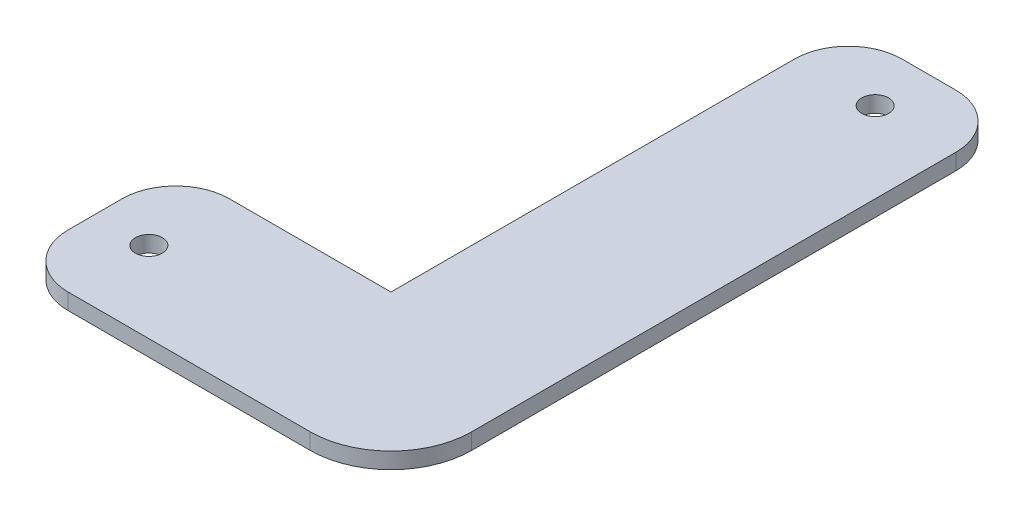
ISO-10303-21;
HEADER;
FILE_DESCRIPTION(('STEP AP214'),'2;1');
FILE_NAME('part.step','',(''),(''),'','','');
FILE_SCHEMA(('AUTOMOTIVE_DESIGN { 1 0 10303 214 1 1 1 1 }'));
ENDSEC;
DATA;
#1=APPLICATION_CONTEXT('core data for automotive mechanical design processes');
#2=APPLICATION_PROTOCOL_DEFINITION('international standard','automotive_design',2000,#1);
#3=PRODUCT_CONTEXT('',#1,'mechanical');
#4=PRODUCT('Part','Part','',(#3));
#5=PRODUCT_RELATED_PRODUCT_CATEGORY('part','',(#4));
#6=PRODUCT_DEFINITION_FORMATION('','',#4);
#7=PRODUCT_DEFINITION_CONTEXT('part definition',#1,'design');
#8=PRODUCT_DEFINITION('design','',#6,#7);
#9=PRODUCT_DEFINITION_SHAPE('','',#8);
#10=(LENGTH_UNIT() NAMED_UNIT(*) SI_UNIT(.MILLI.,.METRE.));
#11=(NAMED_UNIT(*) PLANE_ANGLE_UNIT() SI_UNIT($,.RADIAN.));
#12=(NAMED_UNIT(*) SI_UNIT($,.STERADIAN.) SOLID_ANGLE_UNIT());
#13=UNCERTAINTY_MEASURE_WITH_UNIT(LENGTH_MEASURE(1.E-05),#10,'distance_accuracy_value','');
#14=(GEOMETRIC_REPRESENTATION_CONTEXT(3) GLOBAL_UNCERTAINTY_ASSIGNED_CONTEXT((#13)) GLOBAL_UNIT_ASSIGNED_CONTEXT((#10,
#11,#12)) REPRESENTATION_CONTEXT('',''));
#15=CARTESIAN_POINT('',(0.,0.,0.));
#16=DIRECTION('',(0.,0.,1.));
#17=DIRECTION('',(1.,0.,0.));
#18=AXIS2_PLACEMENT_3D('',#15,#16,#17);
#19=CARTESIAN_POINT('',(0.,3.,-115.));
#20=DIRECTION('',(1.,0.,0.));
#21=DIRECTION('',(0.,0.,-1.));
#22=AXIS2_PLACEMENT_3D('',#19,#20,#21);
#23=PLANE('',#22);
#24=DIRECTION('',(0.,0.,1.));
#25=VECTOR('',#24,1.);
#26=CARTESIAN_POINT('',(0.,3.,-115.));
#27=LINE('',#26,#25);
#28=CARTESIAN_POINT('',(0.,3.,-105.));
#29=VERTEX_POINT('',#28);
#30=CARTESIAN_POINT('',(0.,3.,-15.));
#31=VERTEX_POINT('',#30);
#32=EDGE_CURVE('E182',#29,#31,#27,.T.);
#33=ORIENTED_EDGE('',*,*,#32,.T.);
#34=DIRECTION('',(0.,-1.,0.));
#35=VECTOR('',#34,1.);
#36=CARTESIAN_POINT('',(0.,3.,-15.));
#37=LINE('',#36,#35);
#38=CARTESIAN_POINT('',(0.,0.,-15.));
#39=VERTEX_POINT('',#38);
#40=EDGE_CURVE('E233',#31,#39,#37,.T.);
#41=ORIENTED_EDGE('',*,*,#40,.T.);
#42=DIRECTION('',(0.,0.,1.));
#43=VECTOR('',#42,1.);
#44=CARTESIAN_POINT('',(0.,0.,-115.));
#45=LINE('',#44,#43);
#46=CARTESIAN_POINT('',(0.,0.,-105.));
#47=VERTEX_POINT('',#46);
#48=EDGE_CURVE('E163',#47,#39,#45,.T.);
#49=ORIENTED_EDGE('',*,*,#48,.F.);
#50=DIRECTION('',(0.,-1.,0.));
#51=VECTOR('',#50,1.);
#52=CARTESIAN_POINT('',(0.,3.,-105.));
#53=LINE('',#52,#51);
#54=EDGE_CURVE('E227',#47,#29,#53,.F.);
#55=ORIENTED_EDGE('',*,*,#54,.T.);
#56=EDGE_LOOP('',(#33,#41,#49,#55));
#57=FACE_BOUND('',#56,.T.);
#58=ADVANCED_FACE('F45',(#57),#23,.T.);
#59=CARTESIAN_POINT('',(0.,3.,-115.));
#60=DIRECTION('',(0.,0.,1.));
#61=DIRECTION('',(1.,0.,0.));
#62=AXIS2_PLACEMENT_3D('',#59,#60,#61);
#63=PLANE('',#62);
#64=DIRECTION('',(-1.,0.,0.));
#65=VECTOR('',#64,1.);
#66=CARTESIAN_POINT('',(0.,3.,-115.));
#67=LINE('',#66,#65);
#68=CARTESIAN_POINT('',(-10.,3.,-115.));
#69=VERTEX_POINT('',#68);
#70=CARTESIAN_POINT('',(-20.,3.,-115.));
#71=VERTEX_POINT('',#70);
#72=EDGE_CURVE('E141',#69,#71,#67,.T.);
#73=ORIENTED_EDGE('',*,*,#72,.F.);
#74=DIRECTION('',(0.,-1.,0.));
#75=VECTOR('',#74,1.);
#76=CARTESIAN_POINT('',(-10.,0.,-115.));
#77=LINE('',#76,#75);
#78=CARTESIAN_POINT('',(-10.,0.,-115.));
#79=VERTEX_POINT('',#78);
#80=EDGE_CURVE('E223',#69,#79,#77,.T.);
#81=ORIENTED_EDGE('',*,*,#80,.T.);
#82=DIRECTION('',(-1.,0.,0.));
#83=VECTOR('',#82,1.);
#84=CARTESIAN_POINT('',(0.,0.,-115.));
#85=LINE('',#84,#83);
#86=CARTESIAN_POINT('',(-20.,0.,-115.));
#87=VERTEX_POINT('',#86);
#88=EDGE_CURVE('E179',#79,#87,#85,.T.);
#89=ORIENTED_EDGE('',*,*,#88,.T.);
#90=DIRECTION('',(0.,-1.,0.));
#91=VECTOR('',#90,1.);
#92=CARTESIAN_POINT('',(-20.,3.,-115.));
#93=LINE('',#92,#91);
#94=EDGE_CURVE('E220',#87,#71,#93,.F.);
#95=ORIENTED_EDGE('',*,*,#94,.T.);
#96=EDGE_LOOP('',(#73,#81,#89,#95));
#97=FACE_BOUND('',#96,.T.);
#98=ADVANCED_FACE('F255',(#97),#63,.F.);
#99=CARTESIAN_POINT('',(-30.,3.,-30.));
#100=DIRECTION('',(-1.,0.,0.));
#101=DIRECTION('',(0.,0.,1.));
#102=AXIS2_PLACEMENT_3D('',#99,#100,#101);
#103=PLANE('',#102);
#104=DIRECTION('',(0.,0.,-1.));
#105=VECTOR('',#104,1.);
#106=CARTESIAN_POINT('',(-30.,3.,-30.));
#107=LINE('',#106,#105);
#108=CARTESIAN_POINT('',(-30.,3.,-30.));
#109=VERTEX_POINT('',#108);
#110=CARTESIAN_POINT('',(-30.,3.,-105.));
#111=VERTEX_POINT('',#110);
#112=EDGE_CURVE('E132',#109,#111,#107,.T.);
#113=ORIENTED_EDGE('',*,*,#112,.T.);
#114=DIRECTION('',(0.,-1.,0.));
#115=VECTOR('',#114,1.);
#116=CARTESIAN_POINT('',(-30.,0.,-105.));
#117=LINE('',#116,#115);
#118=CARTESIAN_POINT('',(-30.,0.,-105.));
#119=VERTEX_POINT('',#118);
#120=EDGE_CURVE('E230',#111,#119,#117,.T.);
#121=ORIENTED_EDGE('',*,*,#120,.T.);
#122=DIRECTION('',(0.,0.,-1.));
#123=VECTOR('',#122,1.);
#124=CARTESIAN_POINT('',(-30.,0.,-30.));
#125=LINE('',#124,#123);
#126=CARTESIAN_POINT('',(-30.,0.,-30.));
#127=VERTEX_POINT('',#126);
#128=EDGE_CURVE('E135',#127,#119,#125,.T.);
#129=ORIENTED_EDGE('',*,*,#128,.F.);
#130=DIRECTION('',(0.,-1.,0.));
#131=VECTOR('',#130,1.);
#132=CARTESIAN_POINT('',(-30.,3.,-30.));
#133=LINE('',#132,#131);
#134=EDGE_CURVE('E127',#109,#127,#133,.T.);
#135=ORIENTED_EDGE('',*,*,#134,.F.);
#136=EDGE_LOOP('',(#113,#121,#129,#135));
#137=FACE_BOUND('',#136,.T.);
#138=ADVANCED_FACE('F129',(#137),#103,.T.);
#139=CARTESIAN_POINT('',(-30.,3.,-30.));
#140=DIRECTION('',(0.,0.,1.));
#141=DIRECTION('',(1.,0.,0.));
#142=AXIS2_PLACEMENT_3D('',#139,#140,#141);
#143=PLANE('',#142);
#144=DIRECTION('',(-1.,0.,0.));
#145=VECTOR('',#144,1.);
#146=CARTESIAN_POINT('',(-30.,0.,-30.));
#147=LINE('',#146,#145);
#148=CARTESIAN_POINT('',(-60.,0.,-30.));
#149=VERTEX_POINT('',#148);
#150=EDGE_CURVE('E174',#127,#149,#147,.T.);
#151=ORIENTED_EDGE('',*,*,#150,.T.);
#152=DIRECTION('',(0.,-1.,0.));
#153=VECTOR('',#152,1.);
#154=CARTESIAN_POINT('',(-60.,3.,-30.));
#155=LINE('',#154,#153);
#156=CARTESIAN_POINT('',(-60.,3.,-30.));
#157=VERTEX_POINT('',#156);
#158=EDGE_CURVE('E147',#149,#157,#155,.F.);
#159=ORIENTED_EDGE('',*,*,#158,.T.);
#160=DIRECTION('',(-1.,0.,0.));
#161=VECTOR('',#160,1.);
#162=CARTESIAN_POINT('',(-30.,3.,-30.));
#163=LINE('',#162,#161);
#164=EDGE_CURVE('E144',#109,#157,#163,.T.);
#165=ORIENTED_EDGE('',*,*,#164,.F.);
#166=ORIENTED_EDGE('',*,*,#134,.T.);
#167=EDGE_LOOP('',(#151,#159,#165,#166));
#168=FACE_BOUND('',#167,.T.);
#169=ADVANCED_FACE('F145',(#168),#143,.F.);
#170=CARTESIAN_POINT('',(-70.,3.,-30.));
#171=DIRECTION('',(1.,0.,0.));
#172=DIRECTION('',(0.,0.,-1.));
#173=AXIS2_PLACEMENT_3D('',#170,#171,#172);
#174=PLANE('',#173);
#175=DIRECTION('',(0.,0.,1.));
#176=VECTOR('',#175,1.);
#177=CARTESIAN_POINT('',(-70.,0.,-30.));
#178=LINE('',#177,#176);
#179=CARTESIAN_POINT('',(-70.,0.,-20.));
#180=VERTEX_POINT('',#179);
#181=CARTESIAN_POINT('',(-70.,0.,-10.));
#182=VERTEX_POINT('',#181);
#183=EDGE_CURVE('E170',#180,#182,#178,.T.);
#184=ORIENTED_EDGE('',*,*,#183,.T.);
#185=DIRECTION('',(0.,-1.,0.));
#186=VECTOR('',#185,1.);
#187=CARTESIAN_POINT('',(-70.,3.,-10.));
#188=LINE('',#187,#186);
#189=CARTESIAN_POINT('',(-70.,3.,-10.));
#190=VERTEX_POINT('',#189);
#191=EDGE_CURVE('E203',#182,#190,#188,.F.);
#192=ORIENTED_EDGE('',*,*,#191,.T.);
#193=DIRECTION('',(0.,0.,1.));
#194=VECTOR('',#193,1.);
#195=CARTESIAN_POINT('',(-70.,3.,-30.));
#196=LINE('',#195,#194);
#197=CARTESIAN_POINT('',(-70.,3.,-20.));
#198=VERTEX_POINT('',#197);
#199=EDGE_CURVE('E151',#198,#190,#196,.T.);
#200=ORIENTED_EDGE('',*,*,#199,.F.);
#201=DIRECTION('',(0.,-1.,0.));
#202=VECTOR('',#201,1.);
#203=CARTESIAN_POINT('',(-70.,3.,-20.));
#204=LINE('',#203,#202);
#205=EDGE_CURVE('E199',#198,#180,#204,.T.);
#206=ORIENTED_EDGE('',*,*,#205,.T.);
#207=EDGE_LOOP('',(#184,#192,#200,#206));
#208=FACE_BOUND('',#207,.T.);
#209=ADVANCED_FACE('F267',(#208),#174,.F.);
#210=CARTESIAN_POINT('',(0.,3.,0.));
#211=DIRECTION('',(0.,0.,1.));
#212=DIRECTION('',(1.,0.,0.));
#213=AXIS2_PLACEMENT_3D('',#210,#211,#212);
#214=PLANE('',#213);
#215=DIRECTION('',(-1.,0.,0.));
#216=VECTOR('',#215,1.);
#217=CARTESIAN_POINT('',(0.,0.,0.));
#218=LINE('',#217,#216);
#219=CARTESIAN_POINT('',(-15.,0.,0.));
#220=VERTEX_POINT('',#219);
#221=CARTESIAN_POINT('',(-60.,0.,0.));
#222=VERTEX_POINT('',#221);
#223=EDGE_CURVE('E166',#220,#222,#218,.T.);
#224=ORIENTED_EDGE('',*,*,#223,.F.);
#225=DIRECTION('',(0.,-1.,0.));
#226=VECTOR('',#225,1.);
#227=CARTESIAN_POINT('',(-15.,3.,0.));
#228=LINE('',#227,#226);
#229=CARTESIAN_POINT('',(-15.,3.,0.));
#230=VERTEX_POINT('',#229);
#231=EDGE_CURVE('E54',#220,#230,#228,.F.);
#232=ORIENTED_EDGE('',*,*,#231,.T.);
#233=DIRECTION('',(-1.,0.,0.));
#234=VECTOR('',#233,1.);
#235=CARTESIAN_POINT('',(0.,3.,0.));
#236=LINE('',#235,#234);
#237=CARTESIAN_POINT('',(-60.,3.,0.));
#238=VERTEX_POINT('',#237);
#239=EDGE_CURVE('E270',#230,#238,#236,.T.);
#240=ORIENTED_EDGE('',*,*,#239,.T.);
#241=DIRECTION('',(0.,-1.,0.));
#242=VECTOR('',#241,1.);
#243=CARTESIAN_POINT('',(-60.,0.,0.));
#244=LINE('',#243,#242);
#245=EDGE_CURVE('E140',#238,#222,#244,.T.);
#246=ORIENTED_EDGE('',*,*,#245,.T.);
#247=EDGE_LOOP('',(#224,#232,#240,#246));
#248=FACE_BOUND('',#247,.T.);
#249=ADVANCED_FACE('F303',(#248),#214,.T.);
#250=CARTESIAN_POINT('',(0.,3.,0.));
#251=DIRECTION('',(0.,-1.,0.));
#252=DIRECTION('',(0.,0.,-1.));
#253=AXIS2_PLACEMENT_3D('',#250,#251,#252);
#254=PLANE('',#253);
#255=CARTESIAN_POINT('',(-60.,3.,-15.));
#256=DIRECTION('',(0.,1.,0.));
#257=DIRECTION('',(0.,0.,1.));
#258=AXIS2_PLACEMENT_3D('',#255,#256,#257);
#259=CIRCLE('',#258,2.5);
#260=CARTESIAN_POINT('',(-60.,3.,-12.5));
#261=VERTEX_POINT('',#260);
#262=EDGE_CURVE('E284',#261,#261,#259,.T.);
#263=ORIENTED_EDGE('',*,*,#262,.F.);
#264=EDGE_LOOP('',(#263));
#265=FACE_BOUND('',#264,.T.);
#266=CARTESIAN_POINT('',(-15.,3.,-105.));
#267=DIRECTION('',(0.,1.,0.));
#268=DIRECTION('',(0.,0.,1.));
#269=AXIS2_PLACEMENT_3D('',#266,#267,#268);
#270=CIRCLE('',#269,2.5);
#271=CARTESIAN_POINT('',(-15.,3.,-102.5));
#272=VERTEX_POINT('',#271);
#273=EDGE_CURVE('E280',#272,#272,#270,.T.);
#274=ORIENTED_EDGE('',*,*,#273,.F.);
#275=EDGE_LOOP('',(#274));
#276=FACE_BOUND('',#275,.T.);
#277=ORIENTED_EDGE('',*,*,#239,.F.);
#278=CARTESIAN_POINT('',(-15.,3.,-15.));
#279=DIRECTION('',(0.,-1.,0.));
#280=DIRECTION('',(0.,0.,-1.));
#281=AXIS2_PLACEMENT_3D('',#278,#279,#280);
#282=CIRCLE('',#281,15.);
#283=EDGE_CURVE('E11',#230,#31,#282,.F.);
#284=ORIENTED_EDGE('',*,*,#283,.T.);
#285=ORIENTED_EDGE('',*,*,#32,.F.);
#286=CARTESIAN_POINT('',(-10.,3.,-105.));
#287=DIRECTION('',(0.,-1.,0.));
#288=DIRECTION('',(0.,0.,-1.));
#289=AXIS2_PLACEMENT_3D('',#286,#287,#288);
#290=CIRCLE('',#289,10.);
#291=EDGE_CURVE('E208',#29,#69,#290,.F.);
#292=ORIENTED_EDGE('',*,*,#291,.T.);
#293=ORIENTED_EDGE('',*,*,#72,.T.);
#294=CARTESIAN_POINT('',(-20.,3.,-105.));
#295=DIRECTION('',(0.,-1.,0.));
#296=DIRECTION('',(0.,0.,-1.));
#297=AXIS2_PLACEMENT_3D('',#294,#295,#296);
#298=CIRCLE('',#297,10.);
#299=EDGE_CURVE('E156',#71,#111,#298,.F.);
#300=ORIENTED_EDGE('',*,*,#299,.T.);
#301=ORIENTED_EDGE('',*,*,#112,.F.);
#302=ORIENTED_EDGE('',*,*,#164,.T.);
#303=CARTESIAN_POINT('',(-60.,3.,-20.));
#304=DIRECTION('',(0.,-1.,0.));
#305=DIRECTION('',(0.,0.,-1.));
#306=AXIS2_PLACEMENT_3D('',#303,#304,#305);
#307=CIRCLE('',#306,10.);
#308=EDGE_CURVE('E211',#157,#198,#307,.F.);
#309=ORIENTED_EDGE('',*,*,#308,.T.);
#310=ORIENTED_EDGE('',*,*,#199,.T.);
#311=CARTESIAN_POINT('',(-60.,3.,-9.99999999999999));
#312=DIRECTION('',(0.,-1.,0.));
#313=DIRECTION('',(0.,0.,-1.));
#314=AXIS2_PLACEMENT_3D('',#311,#312,#313);
#315=CIRCLE('',#314,10.);
#316=EDGE_CURVE('E214',#190,#238,#315,.F.);
#317=ORIENTED_EDGE('',*,*,#316,.T.);
#318=EDGE_LOOP('',(#277,#284,#285,#292,#293,#300,#301,#302,#309,#310,#317));
#319=FACE_BOUND('',#318,.T.);
#320=ADVANCED_FACE('F153',(#265,#276,#319),#254,.F.);
#321=CARTESIAN_POINT('',(0.,0.,0.));
#322=DIRECTION('',(0.,-1.,0.));
#323=DIRECTION('',(0.,0.,-1.));
#324=AXIS2_PLACEMENT_3D('',#321,#322,#323);
#325=PLANE('',#324);
#326=CARTESIAN_POINT('',(-60.,0.,-15.));
#327=DIRECTION('',(0.,1.,0.));
#328=DIRECTION('',(0.,0.,1.));
#329=AXIS2_PLACEMENT_3D('',#326,#327,#328);
#330=CIRCLE('',#329,2.5);
#331=CARTESIAN_POINT('',(-60.,0.,-12.5));
#332=VERTEX_POINT('',#331);
#333=EDGE_CURVE('E167',#332,#332,#330,.T.);
#334=ORIENTED_EDGE('',*,*,#333,.T.);
#335=EDGE_LOOP('',(#334));
#336=FACE_BOUND('',#335,.T.);
#337=CARTESIAN_POINT('',(-15.,0.,-105.));
#338=DIRECTION('',(0.,1.,0.));
#339=DIRECTION('',(0.,0.,1.));
#340=AXIS2_PLACEMENT_3D('',#337,#338,#339);
#341=CIRCLE('',#340,2.5);
#342=CARTESIAN_POINT('',(-15.,0.,-102.5));
#343=VERTEX_POINT('',#342);
#344=EDGE_CURVE('E276',#343,#343,#341,.T.);
#345=ORIENTED_EDGE('',*,*,#344,.T.);
#346=EDGE_LOOP('',(#345));
#347=FACE_BOUND('',#346,.T.);
#348=ORIENTED_EDGE('',*,*,#48,.T.);
#349=CARTESIAN_POINT('',(-15.,0.,-15.));
#350=DIRECTION('',(0.,-1.,0.));
#351=DIRECTION('',(0.,0.,-1.));
#352=AXIS2_PLACEMENT_3D('',#349,#350,#351);
#353=CIRCLE('',#352,15.);
#354=EDGE_CURVE('E68',#39,#220,#353,.T.);
#355=ORIENTED_EDGE('',*,*,#354,.T.);
#356=ORIENTED_EDGE('',*,*,#223,.T.);
#357=CARTESIAN_POINT('',(-60.,0.,-9.99999999999999));
#358=DIRECTION('',(0.,-1.,0.));
#359=DIRECTION('',(0.,0.,-1.));
#360=AXIS2_PLACEMENT_3D('',#357,#358,#359);
#361=CIRCLE('',#360,10.);
#362=EDGE_CURVE('E196',#222,#182,#361,.T.);
#363=ORIENTED_EDGE('',*,*,#362,.T.);
#364=ORIENTED_EDGE('',*,*,#183,.F.);
#365=CARTESIAN_POINT('',(-60.,0.,-20.));
#366=DIRECTION('',(0.,-1.,0.));
#367=DIRECTION('',(0.,0.,-1.));
#368=AXIS2_PLACEMENT_3D('',#365,#366,#367);
#369=CIRCLE('',#368,10.);
#370=EDGE_CURVE('E193',#180,#149,#369,.T.);
#371=ORIENTED_EDGE('',*,*,#370,.T.);
#372=ORIENTED_EDGE('',*,*,#150,.F.);
#373=ORIENTED_EDGE('',*,*,#128,.T.);
#374=CARTESIAN_POINT('',(-20.,0.,-105.));
#375=DIRECTION('',(0.,-1.,0.));
#376=DIRECTION('',(0.,0.,-1.));
#377=AXIS2_PLACEMENT_3D('',#374,#375,#376);
#378=CIRCLE('',#377,10.);
#379=EDGE_CURVE('E187',#119,#87,#378,.T.);
#380=ORIENTED_EDGE('',*,*,#379,.T.);
#381=ORIENTED_EDGE('',*,*,#88,.F.);
#382=CARTESIAN_POINT('',(-10.,0.,-105.));
#383=DIRECTION('',(0.,-1.,0.));
#384=DIRECTION('',(0.,0.,-1.));
#385=AXIS2_PLACEMENT_3D('',#382,#383,#384);
#386=CIRCLE('',#385,10.);
#387=EDGE_CURVE('E190',#79,#47,#386,.T.);
#388=ORIENTED_EDGE('',*,*,#387,.T.);
#389=EDGE_LOOP('',(#348,#355,#356,#363,#364,#371,#372,#373,#380,#381,#388));
#390=FACE_BOUND('',#389,.T.);
#391=ADVANCED_FACE('F247',(#336,#347,#390),#325,.T.);
#392=CARTESIAN_POINT('',(-60.,3.,-9.99999999999999));
#393=DIRECTION('',(0.,1.,0.));
#394=DIRECTION('',(0.,0.,1.));
#395=AXIS2_PLACEMENT_3D('',#392,#393,#394);
#396=CYLINDRICAL_SURFACE('',#395,10.);
#397=ORIENTED_EDGE('',*,*,#316,.F.);
#398=ORIENTED_EDGE('',*,*,#191,.F.);
#399=ORIENTED_EDGE('',*,*,#362,.F.);
#400=ORIENTED_EDGE('',*,*,#245,.F.);
#401=EDGE_LOOP('',(#397,#398,#399,#400));
#402=FACE_BOUND('',#401,.T.);
#403=ADVANCED_FACE('F326',(#402),#396,.T.);
#404=CARTESIAN_POINT('',(-60.,3.,-20.));
#405=DIRECTION('',(0.,-1.,0.));
#406=DIRECTION('',(0.,0.,-1.));
#407=AXIS2_PLACEMENT_3D('',#404,#405,#406);
#408=CYLINDRICAL_SURFACE('',#407,10.);
#409=ORIENTED_EDGE('',*,*,#308,.F.);
#410=ORIENTED_EDGE('',*,*,#158,.F.);
#411=ORIENTED_EDGE('',*,*,#370,.F.);
#412=ORIENTED_EDGE('',*,*,#205,.F.);
#413=EDGE_LOOP('',(#409,#410,#411,#412));
#414=FACE_BOUND('',#413,.T.);
#415=ADVANCED_FACE('F261',(#414),#408,.T.);
#416=CARTESIAN_POINT('',(-10.,3.,-105.));
#417=DIRECTION('',(0.,1.,0.));
#418=DIRECTION('',(0.,0.,1.));
#419=AXIS2_PLACEMENT_3D('',#416,#417,#418);
#420=CYLINDRICAL_SURFACE('',#419,10.);
#421=ORIENTED_EDGE('',*,*,#291,.F.);
#422=ORIENTED_EDGE('',*,*,#54,.F.);
#423=ORIENTED_EDGE('',*,*,#387,.F.);
#424=ORIENTED_EDGE('',*,*,#80,.F.);
#425=EDGE_LOOP('',(#421,#422,#423,#424));
#426=FACE_BOUND('',#425,.T.);
#427=ADVANCED_FACE('F252',(#426),#420,.T.);
#428=CARTESIAN_POINT('',(-20.,3.,-105.));
#429=DIRECTION('',(0.,1.,0.));
#430=DIRECTION('',(0.,0.,1.));
#431=AXIS2_PLACEMENT_3D('',#428,#429,#430);
#432=CYLINDRICAL_SURFACE('',#431,10.);
#433=ORIENTED_EDGE('',*,*,#299,.F.);
#434=ORIENTED_EDGE('',*,*,#94,.F.);
#435=ORIENTED_EDGE('',*,*,#379,.F.);
#436=ORIENTED_EDGE('',*,*,#120,.F.);
#437=EDGE_LOOP('',(#433,#434,#435,#436));
#438=FACE_BOUND('',#437,.T.);
#439=ADVANCED_FACE('F258',(#438),#432,.T.);
#440=CARTESIAN_POINT('',(-15.,3.,-15.));
#441=DIRECTION('',(0.,-1.,0.));
#442=DIRECTION('',(0.,0.,-1.));
#443=AXIS2_PLACEMENT_3D('',#440,#441,#442);
#444=CYLINDRICAL_SURFACE('',#443,15.);
#445=ORIENTED_EDGE('',*,*,#283,.F.);
#446=ORIENTED_EDGE('',*,*,#231,.F.);
#447=ORIENTED_EDGE('',*,*,#354,.F.);
#448=ORIENTED_EDGE('',*,*,#40,.F.);
#449=EDGE_LOOP('',(#445,#446,#447,#448));
#450=FACE_BOUND('',#449,.T.);
#451=ADVANCED_FACE('F47',(#450),#444,.T.);
#452=CARTESIAN_POINT('',(-15.,0.,-105.));
#453=DIRECTION('',(0.,1.,0.));
#454=DIRECTION('',(0.,0.,1.));
#455=AXIS2_PLACEMENT_3D('',#452,#453,#454);
#456=CYLINDRICAL_SURFACE('',#455,2.5);
#457=ORIENTED_EDGE('',*,*,#344,.F.);
#458=EDGE_LOOP('',(#457));
#459=FACE_BOUND('',#458,.T.);
#460=ORIENTED_EDGE('',*,*,#273,.T.);
#461=EDGE_LOOP('',(#460));
#462=FACE_BOUND('',#461,.T.);
#463=ADVANCED_FACE('F297',(#459,#462),#456,.F.);
#464=CARTESIAN_POINT('',(-60.,0.,-15.));
#465=DIRECTION('',(0.,1.,0.));
#466=DIRECTION('',(0.,0.,1.));
#467=AXIS2_PLACEMENT_3D('',#464,#465,#466);
#468=CYLINDRICAL_SURFACE('',#467,2.5);
#469=ORIENTED_EDGE('',*,*,#333,.F.);
#470=EDGE_LOOP('',(#469));
#471=FACE_BOUND('',#470,.T.);
#472=ORIENTED_EDGE('',*,*,#262,.T.);
#473=EDGE_LOOP('',(#472));
#474=FACE_BOUND('',#473,.T.);
#475=ADVANCED_FACE('F294',(#471,#474),#468,.F.);
#476=CLOSED_SHELL('',(#58,#98,#138,#169,#209,#249,#320,#391,#403,#415,#427,#439,#451,#463,#475));
#477=MANIFOLD_SOLID_BREP('B2',#476);
#478=ADVANCED_BREP_SHAPE_REPRESENTATION('',(#18,#477),#14);
#479=SHAPE_DEFINITION_REPRESENTATION(#9,#478);
ENDSEC;
END-ISO-10303-21;
